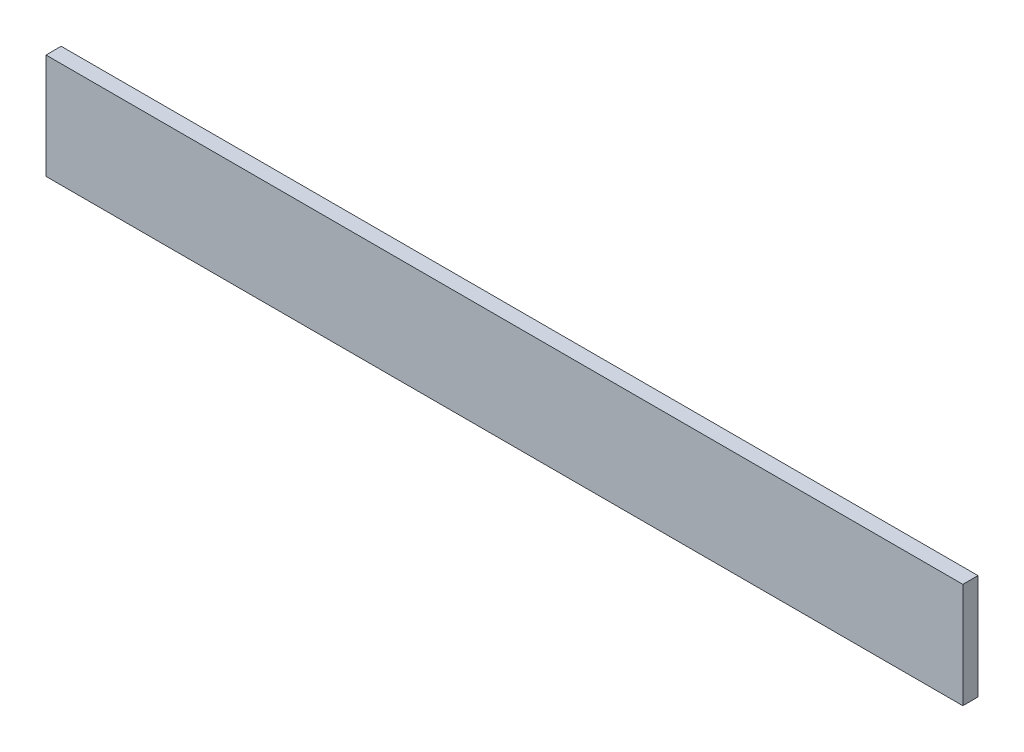
ISO-10303-21;
HEADER;
FILE_DESCRIPTION(('STEP AP214'),'2;1');
FILE_NAME('part.step','',(''),(''),'','','');
FILE_SCHEMA(('AUTOMOTIVE_DESIGN { 1 0 10303 214 1 1 1 1 }'));
ENDSEC;
DATA;
#1=APPLICATION_CONTEXT('core data for automotive mechanical design processes');
#2=APPLICATION_PROTOCOL_DEFINITION('international standard','automotive_design',2000,#1);
#3=PRODUCT_CONTEXT('',#1,'mechanical');
#4=PRODUCT('Part','Part','',(#3));
#5=PRODUCT_RELATED_PRODUCT_CATEGORY('part','',(#4));
#6=PRODUCT_DEFINITION_FORMATION('','',#4);
#7=PRODUCT_DEFINITION_CONTEXT('part definition',#1,'design');
#8=PRODUCT_DEFINITION('design','',#6,#7);
#9=PRODUCT_DEFINITION_SHAPE('','',#8);
#10=(LENGTH_UNIT() NAMED_UNIT(*) SI_UNIT(.MILLI.,.METRE.));
#11=(NAMED_UNIT(*) PLANE_ANGLE_UNIT() SI_UNIT($,.RADIAN.));
#12=(NAMED_UNIT(*) SI_UNIT($,.STERADIAN.) SOLID_ANGLE_UNIT());
#13=UNCERTAINTY_MEASURE_WITH_UNIT(LENGTH_MEASURE(1.E-05),#10,'distance_accuracy_value','');
#14=(GEOMETRIC_REPRESENTATION_CONTEXT(3) GLOBAL_UNCERTAINTY_ASSIGNED_CONTEXT((#13)) GLOBAL_UNIT_ASSIGNED_CONTEXT((#10,
#11,#12)) REPRESENTATION_CONTEXT('',''));
#15=CARTESIAN_POINT('',(0.,0.,0.));
#16=DIRECTION('',(0.,0.,1.));
#17=DIRECTION('',(1.,0.,0.));
#18=AXIS2_PLACEMENT_3D('',#15,#16,#17);
#19=CARTESIAN_POINT('',(-70.467811984372,34.6035111805918,5.));
#20=DIRECTION('',(1.,0.,0.));
#21=DIRECTION('',(0.,0.,-1.));
#22=AXIS2_PLACEMENT_3D('',#19,#20,#21);
#23=PLANE('',#22);
#24=DIRECTION('',(0.,-1.,0.));
#25=VECTOR('',#24,1.);
#26=CARTESIAN_POINT('',(-70.467811984372,34.6035111805918,0.));
#27=LINE('',#26,#25);
#28=CARTESIAN_POINT('',(-70.467811984372,69.2707722113255,0.));
#29=VERTEX_POINT('',#28);
#30=CARTESIAN_POINT('',(-70.467811984372,34.6035111805918,0.));
#31=VERTEX_POINT('',#30);
#32=EDGE_CURVE('E98',#29,#31,#27,.T.);
#33=ORIENTED_EDGE('',*,*,#32,.T.);
#34=DIRECTION('',(0.,0.,-1.));
#35=VECTOR('',#34,1.);
#36=CARTESIAN_POINT('',(-70.467811984372,34.6035111805918,5.));
#37=LINE('',#36,#35);
#38=CARTESIAN_POINT('',(-70.467811984372,34.6035111805918,5.));
#39=VERTEX_POINT('',#38);
#40=EDGE_CURVE('E11',#39,#31,#37,.T.);
#41=ORIENTED_EDGE('',*,*,#40,.F.);
#42=DIRECTION('',(0.,-1.,0.));
#43=VECTOR('',#42,1.);
#44=CARTESIAN_POINT('',(-70.467811984372,34.6035111805918,5.));
#45=LINE('',#44,#43);
#46=CARTESIAN_POINT('',(-70.467811984372,69.2707722113255,5.));
#47=VERTEX_POINT('',#46);
#48=EDGE_CURVE('E86',#47,#39,#45,.T.);
#49=ORIENTED_EDGE('',*,*,#48,.F.);
#50=DIRECTION('',(0.,0.,-1.));
#51=VECTOR('',#50,1.);
#52=CARTESIAN_POINT('',(-70.467811984372,69.2707722113255,5.));
#53=LINE('',#52,#51);
#54=EDGE_CURVE('E94',#47,#29,#53,.T.);
#55=ORIENTED_EDGE('',*,*,#54,.T.);
#56=EDGE_LOOP('',(#33,#41,#49,#55));
#57=FACE_BOUND('',#56,.T.);
#58=ADVANCED_FACE('F35',(#57),#23,.F.);
#59=CARTESIAN_POINT('',(-70.467811984372,34.6035111805918,5.));
#60=DIRECTION('',(0.,1.,0.));
#61=DIRECTION('',(0.,0.,1.));
#62=AXIS2_PLACEMENT_3D('',#59,#60,#61);
#63=PLANE('',#62);
#64=DIRECTION('',(1.,0.,0.));
#65=VECTOR('',#64,1.);
#66=CARTESIAN_POINT('',(-70.467811984372,34.6035111805918,0.));
#67=LINE('',#66,#65);
#68=CARTESIAN_POINT('',(231.792752485148,34.6035111805918,0.));
#69=VERTEX_POINT('',#68);
#70=EDGE_CURVE('E90',#31,#69,#67,.T.);
#71=ORIENTED_EDGE('',*,*,#70,.T.);
#72=DIRECTION('',(0.,0.,-1.));
#73=VECTOR('',#72,1.);
#74=CARTESIAN_POINT('',(231.792752485148,34.6035111805918,5.));
#75=LINE('',#74,#73);
#76=CARTESIAN_POINT('',(231.792752485148,34.6035111805918,5.));
#77=VERTEX_POINT('',#76);
#78=EDGE_CURVE('E43',#77,#69,#75,.T.);
#79=ORIENTED_EDGE('',*,*,#78,.F.);
#80=DIRECTION('',(1.,0.,0.));
#81=VECTOR('',#80,1.);
#82=CARTESIAN_POINT('',(-70.467811984372,34.6035111805918,5.));
#83=LINE('',#82,#81);
#84=EDGE_CURVE('E81',#39,#77,#83,.T.);
#85=ORIENTED_EDGE('',*,*,#84,.F.);
#86=ORIENTED_EDGE('',*,*,#40,.T.);
#87=EDGE_LOOP('',(#71,#79,#85,#86));
#88=FACE_BOUND('',#87,.T.);
#89=ADVANCED_FACE('F89',(#88),#63,.F.);
#90=CARTESIAN_POINT('',(231.792752485148,34.6035111805918,5.));
#91=DIRECTION('',(-1.,0.,0.));
#92=DIRECTION('',(0.,0.,1.));
#93=AXIS2_PLACEMENT_3D('',#90,#91,#92);
#94=PLANE('',#93);
#95=DIRECTION('',(0.,1.,0.));
#96=VECTOR('',#95,1.);
#97=CARTESIAN_POINT('',(231.792752485148,34.6035111805918,0.));
#98=LINE('',#97,#96);
#99=CARTESIAN_POINT('',(231.792752485148,69.2707722113255,0.));
#100=VERTEX_POINT('',#99);
#101=EDGE_CURVE('E68',#69,#100,#98,.T.);
#102=ORIENTED_EDGE('',*,*,#101,.T.);
#103=DIRECTION('',(0.,0.,-1.));
#104=VECTOR('',#103,1.);
#105=CARTESIAN_POINT('',(231.792752485148,69.2707722113255,5.));
#106=LINE('',#105,#104);
#107=CARTESIAN_POINT('',(231.792752485148,69.2707722113255,5.));
#108=VERTEX_POINT('',#107);
#109=EDGE_CURVE('E91',#108,#100,#106,.T.);
#110=ORIENTED_EDGE('',*,*,#109,.F.);
#111=DIRECTION('',(0.,1.,0.));
#112=VECTOR('',#111,1.);
#113=CARTESIAN_POINT('',(231.792752485148,34.6035111805918,5.));
#114=LINE('',#113,#112);
#115=EDGE_CURVE('E84',#77,#108,#114,.T.);
#116=ORIENTED_EDGE('',*,*,#115,.F.);
#117=ORIENTED_EDGE('',*,*,#78,.T.);
#118=EDGE_LOOP('',(#102,#110,#116,#117));
#119=FACE_BOUND('',#118,.T.);
#120=ADVANCED_FACE('F92',(#119),#94,.F.);
#121=CARTESIAN_POINT('',(-70.467811984372,69.2707722113255,5.));
#122=DIRECTION('',(0.,-1.,0.));
#123=DIRECTION('',(0.,0.,-1.));
#124=AXIS2_PLACEMENT_3D('',#121,#122,#123);
#125=PLANE('',#124);
#126=DIRECTION('',(-1.,0.,0.));
#127=VECTOR('',#126,1.);
#128=CARTESIAN_POINT('',(-70.467811984372,69.2707722113255,0.));
#129=LINE('',#128,#127);
#130=EDGE_CURVE('E74',#100,#29,#129,.T.);
#131=ORIENTED_EDGE('',*,*,#130,.T.);
#132=ORIENTED_EDGE('',*,*,#54,.F.);
#133=DIRECTION('',(-1.,0.,0.));
#134=VECTOR('',#133,1.);
#135=CARTESIAN_POINT('',(-70.467811984372,69.2707722113255,5.));
#136=LINE('',#135,#134);
#137=EDGE_CURVE('E51',#108,#47,#136,.T.);
#138=ORIENTED_EDGE('',*,*,#137,.F.);
#139=ORIENTED_EDGE('',*,*,#109,.T.);
#140=EDGE_LOOP('',(#131,#132,#138,#139));
#141=FACE_BOUND('',#140,.T.);
#142=ADVANCED_FACE('F105',(#141),#125,.F.);
#143=CARTESIAN_POINT('',(0.,0.,5.));
#144=DIRECTION('',(0.,0.,-1.));
#145=DIRECTION('',(-1.,0.,0.));
#146=AXIS2_PLACEMENT_3D('',#143,#144,#145);
#147=PLANE('',#146);
#148=ORIENTED_EDGE('',*,*,#48,.T.);
#149=ORIENTED_EDGE('',*,*,#84,.T.);
#150=ORIENTED_EDGE('',*,*,#115,.T.);
#151=ORIENTED_EDGE('',*,*,#137,.T.);
#152=EDGE_LOOP('',(#148,#149,#150,#151));
#153=FACE_BOUND('',#152,.T.);
#154=ADVANCED_FACE('F82',(#153),#147,.F.);
#155=CARTESIAN_POINT('',(0.,0.,0.));
#156=DIRECTION('',(0.,0.,-1.));
#157=DIRECTION('',(-1.,0.,0.));
#158=AXIS2_PLACEMENT_3D('',#155,#156,#157);
#159=PLANE('',#158);
#160=ORIENTED_EDGE('',*,*,#32,.F.);
#161=ORIENTED_EDGE('',*,*,#130,.F.);
#162=ORIENTED_EDGE('',*,*,#101,.F.);
#163=ORIENTED_EDGE('',*,*,#70,.F.);
#164=EDGE_LOOP('',(#160,#161,#162,#163));
#165=FACE_BOUND('',#164,.T.);
#166=ADVANCED_FACE('F108',(#165),#159,.T.);
#167=CLOSED_SHELL('',(#58,#89,#120,#142,#154,#166));
#168=MANIFOLD_SOLID_BREP('B2',#167);
#169=ADVANCED_BREP_SHAPE_REPRESENTATION('',(#18,#168),#14);
#170=SHAPE_DEFINITION_REPRESENTATION(#9,#169);
ENDSEC;
END-ISO-10303-21;
